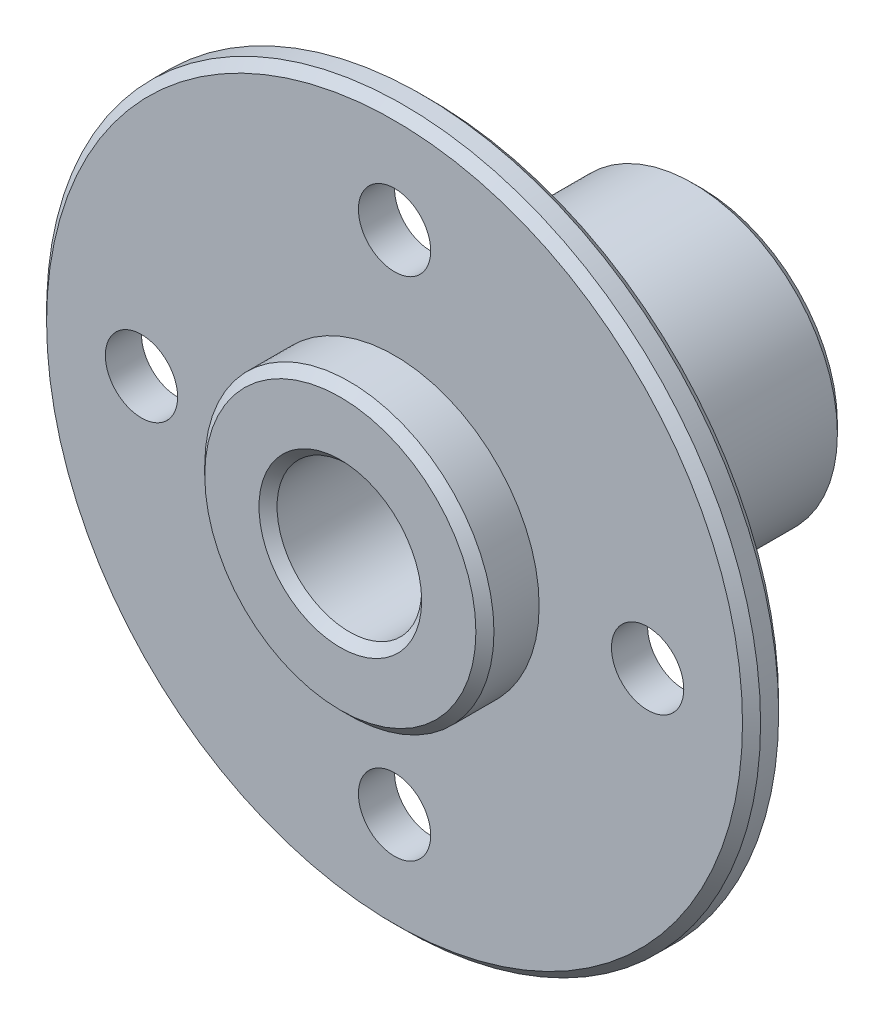
ISO-10303-21;
HEADER;
FILE_DESCRIPTION(('STEP AP214'),'2;1');
FILE_NAME('part.step','',(''),(''),'','','');
FILE_SCHEMA(('AUTOMOTIVE_DESIGN { 1 0 10303 214 1 1 1 1 }'));
ENDSEC;
DATA;
#1=APPLICATION_CONTEXT('core data for automotive mechanical design processes');
#2=APPLICATION_PROTOCOL_DEFINITION('international standard','automotive_design',2000,#1);
#3=PRODUCT_CONTEXT('',#1,'mechanical');
#4=PRODUCT('Part','Part','',(#3));
#5=PRODUCT_RELATED_PRODUCT_CATEGORY('part','',(#4));
#6=PRODUCT_DEFINITION_FORMATION('','',#4);
#7=PRODUCT_DEFINITION_CONTEXT('part definition',#1,'design');
#8=PRODUCT_DEFINITION('design','',#6,#7);
#9=PRODUCT_DEFINITION_SHAPE('','',#8);
#10=(LENGTH_UNIT() NAMED_UNIT(*) SI_UNIT(.MILLI.,.METRE.));
#11=(NAMED_UNIT(*) PLANE_ANGLE_UNIT() SI_UNIT($,.RADIAN.));
#12=(NAMED_UNIT(*) SI_UNIT($,.STERADIAN.) SOLID_ANGLE_UNIT());
#13=UNCERTAINTY_MEASURE_WITH_UNIT(LENGTH_MEASURE(1.E-05),#10,'distance_accuracy_value','');
#14=(GEOMETRIC_REPRESENTATION_CONTEXT(3) GLOBAL_UNCERTAINTY_ASSIGNED_CONTEXT((#13)) GLOBAL_UNIT_ASSIGNED_CONTEXT((#10,
#11,#12)) REPRESENTATION_CONTEXT('',''));
#15=CARTESIAN_POINT('',(0.,0.,0.));
#16=DIRECTION('',(0.,0.,1.));
#17=DIRECTION('',(1.,0.,0.));
#18=AXIS2_PLACEMENT_3D('',#15,#16,#17);
#19=CARTESIAN_POINT('',(0.,0.,0.));
#20=DIRECTION('',(0.,0.,1.));
#21=DIRECTION('',(1.,0.,0.));
#22=AXIS2_PLACEMENT_3D('',#19,#20,#21);
#23=PLANE('',#22);
#24=CARTESIAN_POINT('',(0.,0.,0.));
#25=DIRECTION('',(0.,0.,1.));
#26=DIRECTION('',(1.,0.,0.));
#27=AXIS2_PLACEMENT_3D('',#24,#25,#26);
#28=CIRCLE('',#27,19.25);
#29=CARTESIAN_POINT('',(19.25,0.,0.));
#30=VERTEX_POINT('',#29);
#31=EDGE_CURVE('E51',#30,#30,#28,.F.);
#32=ORIENTED_EDGE('',*,*,#31,.T.);
#33=EDGE_LOOP('',(#32));
#34=FACE_BOUND('',#33,.T.);
#35=CARTESIAN_POINT('',(0.,14.,0.));
#36=DIRECTION('',(0.,0.,1.));
#37=DIRECTION('',(1.,0.,0.));
#38=AXIS2_PLACEMENT_3D('',#35,#36,#37);
#39=CIRCLE('',#38,1.99999999999999);
#40=CARTESIAN_POINT('',(1.99999999999999,14.,0.));
#41=VERTEX_POINT('',#40);
#42=EDGE_CURVE('E99',#41,#41,#39,.T.);
#43=ORIENTED_EDGE('',*,*,#42,.T.);
#44=EDGE_LOOP('',(#43));
#45=FACE_BOUND('',#44,.T.);
#46=CARTESIAN_POINT('',(0.,-14.,0.));
#47=DIRECTION('',(0.,0.,1.));
#48=DIRECTION('',(1.,0.,0.));
#49=AXIS2_PLACEMENT_3D('',#46,#47,#48);
#50=CIRCLE('',#49,1.99999999999999);
#51=CARTESIAN_POINT('',(2.,-14.,0.));
#52=VERTEX_POINT('',#51);
#53=EDGE_CURVE('E93',#52,#52,#50,.T.);
#54=ORIENTED_EDGE('',*,*,#53,.T.);
#55=EDGE_LOOP('',(#54));
#56=FACE_BOUND('',#55,.T.);
#57=CARTESIAN_POINT('',(-14.,0.,0.));
#58=DIRECTION('',(0.,0.,1.));
#59=DIRECTION('',(1.,0.,0.));
#60=AXIS2_PLACEMENT_3D('',#57,#58,#59);
#61=CIRCLE('',#60,1.99999999999999);
#62=CARTESIAN_POINT('',(-12.,0.,0.));
#63=VERTEX_POINT('',#62);
#64=EDGE_CURVE('E87',#63,#63,#61,.T.);
#65=ORIENTED_EDGE('',*,*,#64,.T.);
#66=EDGE_LOOP('',(#65));
#67=FACE_BOUND('',#66,.T.);
#68=CARTESIAN_POINT('',(14.,0.,0.));
#69=DIRECTION('',(0.,0.,1.));
#70=DIRECTION('',(1.,0.,0.));
#71=AXIS2_PLACEMENT_3D('',#68,#69,#70);
#72=CIRCLE('',#71,1.99999999999999);
#73=CARTESIAN_POINT('',(16.,0.,0.));
#74=VERTEX_POINT('',#73);
#75=EDGE_CURVE('E81',#74,#74,#72,.T.);
#76=ORIENTED_EDGE('',*,*,#75,.T.);
#77=EDGE_LOOP('',(#76));
#78=FACE_BOUND('',#77,.T.);
#79=CARTESIAN_POINT('',(0.,0.,0.));
#80=DIRECTION('',(0.,0.,1.));
#81=DIRECTION('',(1.,0.,0.));
#82=AXIS2_PLACEMENT_3D('',#79,#80,#81);
#83=CIRCLE('',#82,8.);
#84=CARTESIAN_POINT('',(8.,0.,0.));
#85=VERTEX_POINT('',#84);
#86=EDGE_CURVE('E75',#85,#85,#83,.F.);
#87=ORIENTED_EDGE('',*,*,#86,.F.);
#88=EDGE_LOOP('',(#87));
#89=FACE_BOUND('',#88,.T.);
#90=ADVANCED_FACE('F31',(#34,#45,#56,#67,#78,#89),#23,.F.);
#91=CARTESIAN_POINT('',(0.,0.,2.));
#92=DIRECTION('',(0.,0.,1.));
#93=DIRECTION('',(1.,0.,0.));
#94=AXIS2_PLACEMENT_3D('',#91,#92,#93);
#95=PLANE('',#94);
#96=CARTESIAN_POINT('',(0.,0.,2.));
#97=DIRECTION('',(0.,0.,1.));
#98=DIRECTION('',(1.,0.,0.));
#99=AXIS2_PLACEMENT_3D('',#96,#97,#98);
#100=CIRCLE('',#99,19.25);
#101=CARTESIAN_POINT('',(19.25,0.,2.));
#102=VERTEX_POINT('',#101);
#103=EDGE_CURVE('E46',#102,#102,#100,.T.);
#104=ORIENTED_EDGE('',*,*,#103,.T.);
#105=EDGE_LOOP('',(#104));
#106=FACE_BOUND('',#105,.T.);
#107=CARTESIAN_POINT('',(0.,14.,2.));
#108=DIRECTION('',(0.,0.,1.));
#109=DIRECTION('',(1.,0.,0.));
#110=AXIS2_PLACEMENT_3D('',#107,#108,#109);
#111=CIRCLE('',#110,1.99999999999999);
#112=CARTESIAN_POINT('',(1.99999999999999,14.,2.));
#113=VERTEX_POINT('',#112);
#114=EDGE_CURVE('E102',#113,#113,#111,.T.);
#115=ORIENTED_EDGE('',*,*,#114,.F.);
#116=EDGE_LOOP('',(#115));
#117=FACE_BOUND('',#116,.T.);
#118=CARTESIAN_POINT('',(0.,-14.,2.));
#119=DIRECTION('',(0.,0.,1.));
#120=DIRECTION('',(1.,0.,0.));
#121=AXIS2_PLACEMENT_3D('',#118,#119,#120);
#122=CIRCLE('',#121,1.99999999999999);
#123=CARTESIAN_POINT('',(1.99999999999999,-14.,2.));
#124=VERTEX_POINT('',#123);
#125=EDGE_CURVE('E96',#124,#124,#122,.T.);
#126=ORIENTED_EDGE('',*,*,#125,.F.);
#127=EDGE_LOOP('',(#126));
#128=FACE_BOUND('',#127,.T.);
#129=CARTESIAN_POINT('',(-14.,0.,2.));
#130=DIRECTION('',(0.,0.,1.));
#131=DIRECTION('',(1.,0.,0.));
#132=AXIS2_PLACEMENT_3D('',#129,#130,#131);
#133=CIRCLE('',#132,1.99999999999999);
#134=CARTESIAN_POINT('',(-12.,0.,2.));
#135=VERTEX_POINT('',#134);
#136=EDGE_CURVE('E90',#135,#135,#133,.T.);
#137=ORIENTED_EDGE('',*,*,#136,.F.);
#138=EDGE_LOOP('',(#137));
#139=FACE_BOUND('',#138,.T.);
#140=CARTESIAN_POINT('',(14.,0.,2.));
#141=DIRECTION('',(0.,0.,1.));
#142=DIRECTION('',(1.,0.,0.));
#143=AXIS2_PLACEMENT_3D('',#140,#141,#142);
#144=CIRCLE('',#143,1.99999999999999);
#145=CARTESIAN_POINT('',(16.,0.,2.));
#146=VERTEX_POINT('',#145);
#147=EDGE_CURVE('E84',#146,#146,#144,.T.);
#148=ORIENTED_EDGE('',*,*,#147,.F.);
#149=EDGE_LOOP('',(#148));
#150=FACE_BOUND('',#149,.T.);
#151=CARTESIAN_POINT('',(0.,0.,2.));
#152=DIRECTION('',(0.,0.,1.));
#153=DIRECTION('',(1.,0.,0.));
#154=AXIS2_PLACEMENT_3D('',#151,#152,#153);
#155=CIRCLE('',#154,8.);
#156=CARTESIAN_POINT('',(8.,0.,2.));
#157=VERTEX_POINT('',#156);
#158=EDGE_CURVE('E78',#157,#157,#155,.T.);
#159=ORIENTED_EDGE('',*,*,#158,.F.);
#160=EDGE_LOOP('',(#159));
#161=FACE_BOUND('',#160,.T.);
#162=ADVANCED_FACE('F108',(#106,#117,#128,#139,#150,#161),#95,.T.);
#163=CARTESIAN_POINT('',(0.,0.,2.));
#164=DIRECTION('',(0.,0.,-1.));
#165=DIRECTION('',(-1.,0.,0.));
#166=AXIS2_PLACEMENT_3D('',#163,#164,#165);
#167=CYLINDRICAL_SURFACE('',#166,19.75);
#168=CARTESIAN_POINT('',(0.,0.,0.500000000000004));
#169=DIRECTION('',(0.,0.,1.));
#170=DIRECTION('',(1.,0.,0.));
#171=AXIS2_PLACEMENT_3D('',#168,#169,#170);
#172=CIRCLE('',#171,19.75);
#173=CARTESIAN_POINT('',(19.75,0.,0.500000000000004));
#174=VERTEX_POINT('',#173);
#175=EDGE_CURVE('E54',#174,#174,#172,.T.);
#176=ORIENTED_EDGE('',*,*,#175,.T.);
#177=EDGE_LOOP('',(#176));
#178=FACE_BOUND('',#177,.T.);
#179=CARTESIAN_POINT('',(0.,0.,1.49999999999999));
#180=DIRECTION('',(0.,0.,1.));
#181=DIRECTION('',(1.,0.,0.));
#182=AXIS2_PLACEMENT_3D('',#179,#180,#181);
#183=CIRCLE('',#182,19.75);
#184=CARTESIAN_POINT('',(19.75,0.,1.49999999999999));
#185=VERTEX_POINT('',#184);
#186=EDGE_CURVE('E57',#185,#185,#183,.F.);
#187=ORIENTED_EDGE('',*,*,#186,.T.);
#188=EDGE_LOOP('',(#187));
#189=FACE_BOUND('',#188,.T.);
#190=ADVANCED_FACE('F111',(#178,#189),#167,.T.);
#191=CARTESIAN_POINT('',(0.,0.,5.));
#192=DIRECTION('',(0.,0.,-1.));
#193=DIRECTION('',(-1.,0.,0.));
#194=AXIS2_PLACEMENT_3D('',#191,#192,#193);
#195=CYLINDRICAL_SURFACE('',#194,8.);
#196=CARTESIAN_POINT('',(0.,0.,4.50000000000001));
#197=DIRECTION('',(0.,0.,1.));
#198=DIRECTION('',(1.,0.,0.));
#199=AXIS2_PLACEMENT_3D('',#196,#197,#198);
#200=CIRCLE('',#199,8.);
#201=CARTESIAN_POINT('',(8.,0.,4.50000000000001));
#202=VERTEX_POINT('',#201);
#203=EDGE_CURVE('E10',#202,#202,#200,.F.);
#204=ORIENTED_EDGE('',*,*,#203,.T.);
#205=EDGE_LOOP('',(#204));
#206=FACE_BOUND('',#205,.T.);
#207=ORIENTED_EDGE('',*,*,#158,.T.);
#208=EDGE_LOOP('',(#207));
#209=FACE_BOUND('',#208,.T.);
#210=ADVANCED_FACE('F122',(#206,#209),#195,.T.);
#211=CARTESIAN_POINT('',(0.,0.,5.));
#212=DIRECTION('',(0.,0.,1.));
#213=DIRECTION('',(1.,0.,0.));
#214=AXIS2_PLACEMENT_3D('',#211,#212,#213);
#215=PLANE('',#214);
#216=CARTESIAN_POINT('',(0.,0.,5.));
#217=DIRECTION('',(0.,0.,1.));
#218=DIRECTION('',(1.,0.,0.));
#219=AXIS2_PLACEMENT_3D('',#216,#217,#218);
#220=CIRCLE('',#219,4.5);
#221=CARTESIAN_POINT('',(4.5,0.,5.));
#222=VERTEX_POINT('',#221);
#223=EDGE_CURVE('E38',#222,#222,#220,.F.);
#224=ORIENTED_EDGE('',*,*,#223,.T.);
#225=EDGE_LOOP('',(#224));
#226=FACE_BOUND('',#225,.T.);
#227=CARTESIAN_POINT('',(0.,0.,5.));
#228=DIRECTION('',(0.,0.,1.));
#229=DIRECTION('',(1.,0.,0.));
#230=AXIS2_PLACEMENT_3D('',#227,#228,#229);
#231=CIRCLE('',#230,7.50000000000001);
#232=CARTESIAN_POINT('',(7.50000000000001,0.,5.));
#233=VERTEX_POINT('',#232);
#234=EDGE_CURVE('E42',#233,#233,#231,.T.);
#235=ORIENTED_EDGE('',*,*,#234,.T.);
#236=EDGE_LOOP('',(#235));
#237=FACE_BOUND('',#236,.T.);
#238=ADVANCED_FACE('F124',(#226,#237),#215,.T.);
#239=CARTESIAN_POINT('',(0.,0.,-15.));
#240=DIRECTION('',(0.,0.,1.));
#241=DIRECTION('',(1.,0.,0.));
#242=AXIS2_PLACEMENT_3D('',#239,#240,#241);
#243=CYLINDRICAL_SURFACE('',#242,8.);
#244=CARTESIAN_POINT('',(0.,0.,-14.5));
#245=DIRECTION('',(0.,0.,-1.));
#246=DIRECTION('',(-1.,0.,0.));
#247=AXIS2_PLACEMENT_3D('',#244,#245,#246);
#248=CIRCLE('',#247,8.);
#249=CARTESIAN_POINT('',(-8.,0.,-14.5));
#250=VERTEX_POINT('',#249);
#251=EDGE_CURVE('E60',#250,#250,#248,.F.);
#252=ORIENTED_EDGE('',*,*,#251,.T.);
#253=EDGE_LOOP('',(#252));
#254=FACE_BOUND('',#253,.T.);
#255=ORIENTED_EDGE('',*,*,#86,.T.);
#256=EDGE_LOOP('',(#255));
#257=FACE_BOUND('',#256,.T.);
#258=ADVANCED_FACE('F130',(#254,#257),#243,.T.);
#259=CARTESIAN_POINT('',(0.,0.,-15.));
#260=DIRECTION('',(0.,0.,-1.));
#261=DIRECTION('',(-1.,0.,0.));
#262=AXIS2_PLACEMENT_3D('',#259,#260,#261);
#263=PLANE('',#262);
#264=CARTESIAN_POINT('',(0.,0.,-15.));
#265=DIRECTION('',(0.,0.,-1.));
#266=DIRECTION('',(-1.,0.,0.));
#267=AXIS2_PLACEMENT_3D('',#264,#265,#266);
#268=CIRCLE('',#267,4.5);
#269=CARTESIAN_POINT('',(-4.5,0.,-15.));
#270=VERTEX_POINT('',#269);
#271=EDGE_CURVE('E63',#270,#270,#268,.F.);
#272=ORIENTED_EDGE('',*,*,#271,.T.);
#273=EDGE_LOOP('',(#272));
#274=FACE_BOUND('',#273,.T.);
#275=CARTESIAN_POINT('',(0.,0.,-15.));
#276=DIRECTION('',(0.,0.,-1.));
#277=DIRECTION('',(-1.,0.,0.));
#278=AXIS2_PLACEMENT_3D('',#275,#276,#277);
#279=CIRCLE('',#278,7.5);
#280=CARTESIAN_POINT('',(-7.5,0.,-15.));
#281=VERTEX_POINT('',#280);
#282=EDGE_CURVE('E66',#281,#281,#279,.T.);
#283=ORIENTED_EDGE('',*,*,#282,.T.);
#284=EDGE_LOOP('',(#283));
#285=FACE_BOUND('',#284,.T.);
#286=ADVANCED_FACE('F169',(#274,#285),#263,.T.);
#287=CARTESIAN_POINT('',(0.,0.,5.));
#288=DIRECTION('',(0.,0.,1.));
#289=DIRECTION('',(1.,0.,0.));
#290=AXIS2_PLACEMENT_3D('',#287,#288,#289);
#291=CYLINDRICAL_SURFACE('',#290,4.);
#292=CARTESIAN_POINT('',(0.,0.,-14.5));
#293=DIRECTION('',(0.,0.,-1.));
#294=DIRECTION('',(-1.,0.,0.));
#295=AXIS2_PLACEMENT_3D('',#292,#293,#294);
#296=CIRCLE('',#295,4.);
#297=CARTESIAN_POINT('',(-4.,0.,-14.5));
#298=VERTEX_POINT('',#297);
#299=EDGE_CURVE('E69',#298,#298,#296,.T.);
#300=ORIENTED_EDGE('',*,*,#299,.T.);
#301=EDGE_LOOP('',(#300));
#302=FACE_BOUND('',#301,.T.);
#303=CARTESIAN_POINT('',(0.,0.,4.50000000000001));
#304=DIRECTION('',(0.,0.,1.));
#305=DIRECTION('',(1.,0.,0.));
#306=AXIS2_PLACEMENT_3D('',#303,#304,#305);
#307=CIRCLE('',#306,4.);
#308=CARTESIAN_POINT('',(4.,0.,4.50000000000001));
#309=VERTEX_POINT('',#308);
#310=EDGE_CURVE('E72',#309,#309,#307,.T.);
#311=ORIENTED_EDGE('',*,*,#310,.T.);
#312=EDGE_LOOP('',(#311));
#313=FACE_BOUND('',#312,.T.);
#314=ADVANCED_FACE('F166',(#302,#313),#291,.F.);
#315=CARTESIAN_POINT('',(14.,0.,2.));
#316=DIRECTION('',(0.,0.,1.));
#317=DIRECTION('',(1.,0.,0.));
#318=AXIS2_PLACEMENT_3D('',#315,#316,#317);
#319=CYLINDRICAL_SURFACE('',#318,1.99999999999999);
#320=ORIENTED_EDGE('',*,*,#75,.F.);
#321=EDGE_LOOP('',(#320));
#322=FACE_BOUND('',#321,.T.);
#323=ORIENTED_EDGE('',*,*,#147,.T.);
#324=EDGE_LOOP('',(#323));
#325=FACE_BOUND('',#324,.T.);
#326=ADVANCED_FACE('F168',(#322,#325),#319,.F.);
#327=CARTESIAN_POINT('',(-14.,0.,2.));
#328=DIRECTION('',(0.,0.,1.));
#329=DIRECTION('',(1.,0.,0.));
#330=AXIS2_PLACEMENT_3D('',#327,#328,#329);
#331=CYLINDRICAL_SURFACE('',#330,1.99999999999999);
#332=ORIENTED_EDGE('',*,*,#64,.F.);
#333=EDGE_LOOP('',(#332));
#334=FACE_BOUND('',#333,.T.);
#335=ORIENTED_EDGE('',*,*,#136,.T.);
#336=EDGE_LOOP('',(#335));
#337=FACE_BOUND('',#336,.T.);
#338=ADVANCED_FACE('F176',(#334,#337),#331,.F.);
#339=CARTESIAN_POINT('',(0.,-14.,2.));
#340=DIRECTION('',(0.,0.,1.));
#341=DIRECTION('',(1.,0.,0.));
#342=AXIS2_PLACEMENT_3D('',#339,#340,#341);
#343=CYLINDRICAL_SURFACE('',#342,1.99999999999999);
#344=ORIENTED_EDGE('',*,*,#53,.F.);
#345=EDGE_LOOP('',(#344));
#346=FACE_BOUND('',#345,.T.);
#347=ORIENTED_EDGE('',*,*,#125,.T.);
#348=EDGE_LOOP('',(#347));
#349=FACE_BOUND('',#348,.T.);
#350=ADVANCED_FACE('F248',(#346,#349),#343,.F.);
#351=CARTESIAN_POINT('',(0.,14.,2.));
#352=DIRECTION('',(0.,0.,1.));
#353=DIRECTION('',(1.,0.,0.));
#354=AXIS2_PLACEMENT_3D('',#351,#352,#353);
#355=CYLINDRICAL_SURFACE('',#354,1.99999999999999);
#356=ORIENTED_EDGE('',*,*,#42,.F.);
#357=EDGE_LOOP('',(#356));
#358=FACE_BOUND('',#357,.T.);
#359=ORIENTED_EDGE('',*,*,#114,.T.);
#360=EDGE_LOOP('',(#359));
#361=FACE_BOUND('',#360,.T.);
#362=ADVANCED_FACE('F106',(#358,#361),#355,.F.);
#363=CARTESIAN_POINT('',(0.,0.,-14.5));
#364=DIRECTION('',(0.,0.,-1.));
#365=DIRECTION('',(-1.,0.,0.));
#366=AXIS2_PLACEMENT_3D('',#363,#364,#365);
#367=CONICAL_SURFACE('',#366,4.,0.785398163397455);
#368=ORIENTED_EDGE('',*,*,#271,.F.);
#369=EDGE_LOOP('',(#368));
#370=FACE_BOUND('',#369,.T.);
#371=ORIENTED_EDGE('',*,*,#299,.F.);
#372=EDGE_LOOP('',(#371));
#373=FACE_BOUND('',#372,.T.);
#374=ADVANCED_FACE('F141',(#370,#373),#367,.F.);
#375=CARTESIAN_POINT('',(0.,0.,-15.));
#376=DIRECTION('',(0.,0.,1.));
#377=DIRECTION('',(1.,0.,0.));
#378=AXIS2_PLACEMENT_3D('',#375,#376,#377);
#379=CONICAL_SURFACE('',#378,7.5,0.785398163397448);
#380=ORIENTED_EDGE('',*,*,#251,.F.);
#381=EDGE_LOOP('',(#380));
#382=FACE_BOUND('',#381,.T.);
#383=ORIENTED_EDGE('',*,*,#282,.F.);
#384=EDGE_LOOP('',(#383));
#385=FACE_BOUND('',#384,.T.);
#386=ADVANCED_FACE('F144',(#382,#385),#379,.T.);
#387=CARTESIAN_POINT('',(0.,0.,0.500000000000004));
#388=DIRECTION('',(0.,0.,1.));
#389=DIRECTION('',(1.,0.,0.));
#390=AXIS2_PLACEMENT_3D('',#387,#388,#389);
#391=CONICAL_SURFACE('',#390,19.75,0.785398163397452);
#392=ORIENTED_EDGE('',*,*,#31,.F.);
#393=EDGE_LOOP('',(#392));
#394=FACE_BOUND('',#393,.T.);
#395=ORIENTED_EDGE('',*,*,#175,.F.);
#396=EDGE_LOOP('',(#395));
#397=FACE_BOUND('',#396,.T.);
#398=ADVANCED_FACE('F148',(#394,#397),#391,.T.);
#399=CARTESIAN_POINT('',(0.,0.,2.));
#400=DIRECTION('',(0.,0.,-1.));
#401=DIRECTION('',(-1.,0.,0.));
#402=AXIS2_PLACEMENT_3D('',#399,#400,#401);
#403=CONICAL_SURFACE('',#402,19.25,0.785398163397438);
#404=ORIENTED_EDGE('',*,*,#186,.F.);
#405=EDGE_LOOP('',(#404));
#406=FACE_BOUND('',#405,.T.);
#407=ORIENTED_EDGE('',*,*,#103,.F.);
#408=EDGE_LOOP('',(#407));
#409=FACE_BOUND('',#408,.T.);
#410=ADVANCED_FACE('F152',(#406,#409),#403,.T.);
#411=CARTESIAN_POINT('',(0.,0.,4.50000000000001));
#412=DIRECTION('',(0.,0.,1.));
#413=DIRECTION('',(1.,0.,0.));
#414=AXIS2_PLACEMENT_3D('',#411,#412,#413);
#415=CONICAL_SURFACE('',#414,4.,0.785398163397455);
#416=ORIENTED_EDGE('',*,*,#223,.F.);
#417=EDGE_LOOP('',(#416));
#418=FACE_BOUND('',#417,.T.);
#419=ORIENTED_EDGE('',*,*,#310,.F.);
#420=EDGE_LOOP('',(#419));
#421=FACE_BOUND('',#420,.T.);
#422=ADVANCED_FACE('F155',(#418,#421),#415,.F.);
#423=CARTESIAN_POINT('',(0.,0.,5.));
#424=DIRECTION('',(0.,0.,-1.));
#425=DIRECTION('',(-1.,0.,0.));
#426=AXIS2_PLACEMENT_3D('',#423,#424,#425);
#427=CONICAL_SURFACE('',#426,7.50000000000001,0.785398163397448);
#428=ORIENTED_EDGE('',*,*,#203,.F.);
#429=EDGE_LOOP('',(#428));
#430=FACE_BOUND('',#429,.T.);
#431=ORIENTED_EDGE('',*,*,#234,.F.);
#432=EDGE_LOOP('',(#431));
#433=FACE_BOUND('',#432,.T.);
#434=ADVANCED_FACE('F33',(#430,#433),#427,.T.);
#435=CLOSED_SHELL('',(#90,#162,#190,#210,#238,#258,#286,#314,#326,#338,#350,#362,#374,#386,#398,
#410,#422,#434));
#436=MANIFOLD_SOLID_BREP('B2',#435);
#437=ADVANCED_BREP_SHAPE_REPRESENTATION('',(#18,#436),#14);
#438=SHAPE_DEFINITION_REPRESENTATION(#9,#437);
ENDSEC;
END-ISO-10303-21;
